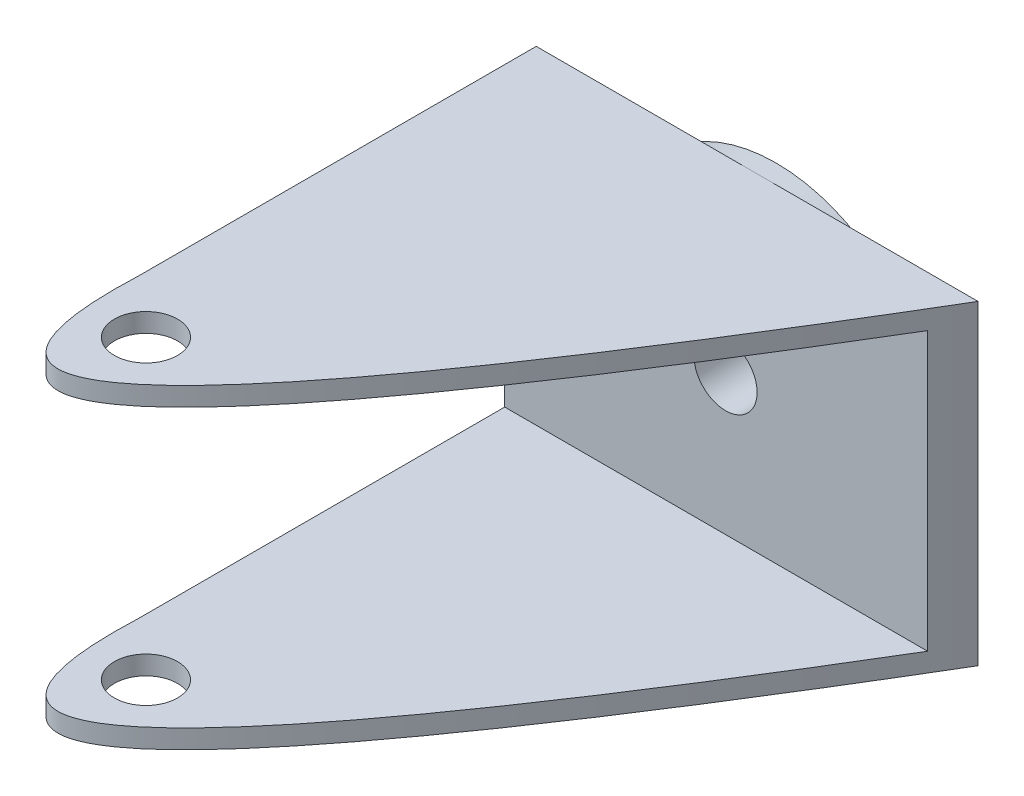
ISO-10303-21;
HEADER;
FILE_DESCRIPTION(('STEP AP214'),'2;1');
FILE_NAME('part.step','',(''),(''),'','','');
FILE_SCHEMA(('AUTOMOTIVE_DESIGN { 1 0 10303 214 1 1 1 1 }'));
ENDSEC;
DATA;
#1=APPLICATION_CONTEXT('core data for automotive mechanical design processes');
#2=APPLICATION_PROTOCOL_DEFINITION('international standard','automotive_design',2000,#1);
#3=PRODUCT_CONTEXT('',#1,'mechanical');
#4=PRODUCT('Part','Part','',(#3));
#5=PRODUCT_RELATED_PRODUCT_CATEGORY('part','',(#4));
#6=PRODUCT_DEFINITION_FORMATION('','',#4);
#7=PRODUCT_DEFINITION_CONTEXT('part definition',#1,'design');
#8=PRODUCT_DEFINITION('design','',#6,#7);
#9=PRODUCT_DEFINITION_SHAPE('','',#8);
#10=(LENGTH_UNIT() NAMED_UNIT(*) SI_UNIT(.MILLI.,.METRE.));
#11=(NAMED_UNIT(*) PLANE_ANGLE_UNIT() SI_UNIT($,.RADIAN.));
#12=(NAMED_UNIT(*) SI_UNIT($,.STERADIAN.) SOLID_ANGLE_UNIT());
#13=UNCERTAINTY_MEASURE_WITH_UNIT(LENGTH_MEASURE(1.E-05),#10,'distance_accuracy_value','');
#14=(GEOMETRIC_REPRESENTATION_CONTEXT(3) GLOBAL_UNCERTAINTY_ASSIGNED_CONTEXT((#13)) GLOBAL_UNIT_ASSIGNED_CONTEXT((#10,
#11,#12)) REPRESENTATION_CONTEXT('',''));
#15=CARTESIAN_POINT('',(0.,0.,0.));
#16=DIRECTION('',(0.,0.,1.));
#17=DIRECTION('',(1.,0.,0.));
#18=AXIS2_PLACEMENT_3D('',#15,#16,#17);
#19=CARTESIAN_POINT('',(-11.3967103896445,39.999851338685,-63.5108558657194));
#20=DIRECTION('',(0.,0.,1.));
#21=DIRECTION('',(1.,0.,0.));
#22=AXIS2_PLACEMENT_3D('',#19,#20,#21);
#23=PLANE('',#22);
#24=CARTESIAN_POINT('',(9.60328961035546,24.999851338685,-63.5108558657194));
#25=DIRECTION('',(0.,0.,-1.));
#26=DIRECTION('',(-1.,0.,0.));
#27=AXIS2_PLACEMENT_3D('',#24,#25,#26);
#28=CIRCLE('',#27,15.);
#29=CARTESIAN_POINT('',(9.60328961035546,9.99985133868499,-63.5108558657194));
#30=VERTEX_POINT('',#29);
#31=CARTESIAN_POINT('',(9.60328961035546,39.999851338685,-63.5108558657194));
#32=VERTEX_POINT('',#31);
#33=EDGE_CURVE('E120',#30,#32,#28,.T.);
#34=ORIENTED_EDGE('',*,*,#33,.F.);
#35=DIRECTION('',(-1.,0.,0.));
#36=VECTOR('',#35,1.);
#37=CARTESIAN_POINT('',(-11.3967103896445,9.99985133868499,-63.5108558657194));
#38=LINE('',#37,#36);
#39=CARTESIAN_POINT('',(-11.3967103896445,9.99985133868499,-63.5108558657194));
#40=VERTEX_POINT('',#39);
#41=EDGE_CURVE('E110',#30,#40,#38,.T.);
#42=ORIENTED_EDGE('',*,*,#41,.T.);
#43=DIRECTION('',(0.,-1.,0.));
#44=VECTOR('',#43,1.);
#45=CARTESIAN_POINT('',(-11.3967103896445,39.999851338685,-63.5108558657194));
#46=LINE('',#45,#44);
#47=CARTESIAN_POINT('',(-11.3967103896445,39.999851338685,-63.5108558657194));
#48=VERTEX_POINT('',#47);
#49=EDGE_CURVE('E11',#48,#40,#46,.T.);
#50=ORIENTED_EDGE('',*,*,#49,.F.);
#51=DIRECTION('',(-1.,0.,0.));
#52=VECTOR('',#51,1.);
#53=CARTESIAN_POINT('',(-11.3967103896445,39.999851338685,-63.5108558657194));
#54=LINE('',#53,#52);
#55=EDGE_CURVE('E83',#32,#48,#54,.T.);
#56=ORIENTED_EDGE('',*,*,#55,.F.);
#57=EDGE_LOOP('',(#34,#42,#50,#56));
#58=FACE_BOUND('',#57,.T.);
#59=ADVANCED_FACE('F40',(#58),#23,.F.);
#60=CARTESIAN_POINT('',(-5.99671038964455,9.99985133868499,-21.0034346858909));
#61=DIRECTION('',(0.,1.,0.));
#62=DIRECTION('',(0.,0.,1.));
#63=AXIS2_PLACEMENT_3D('',#60,#61,#62);
#64=CYLINDRICAL_SURFACE('',#63,3.);
#65=CARTESIAN_POINT('',(-5.99671038964455,38.199851338685,-21.0034346858909));
#66=DIRECTION('',(0.,1.,0.));
#67=DIRECTION('',(0.,0.,1.));
#68=AXIS2_PLACEMENT_3D('',#65,#66,#67);
#69=CIRCLE('',#68,3.);
#70=CARTESIAN_POINT('',(-5.99671038964455,38.199851338685,-18.0034346858909));
#71=VERTEX_POINT('',#70);
#72=EDGE_CURVE('E151',#71,#71,#69,.F.);
#73=ORIENTED_EDGE('',*,*,#72,.T.);
#74=EDGE_LOOP('',(#73));
#75=FACE_BOUND('',#74,.T.);
#76=CARTESIAN_POINT('',(-5.99671038964455,39.999851338685,-21.0034346858909));
#77=DIRECTION('',(0.,1.,0.));
#78=DIRECTION('',(0.,0.,1.));
#79=AXIS2_PLACEMENT_3D('',#76,#77,#78);
#80=CIRCLE('',#79,3.);
#81=CARTESIAN_POINT('',(-5.99671038964455,39.999851338685,-18.0034346858909));
#82=VERTEX_POINT('',#81);
#83=EDGE_CURVE('E160',#82,#82,#80,.T.);
#84=ORIENTED_EDGE('',*,*,#83,.T.);
#85=EDGE_LOOP('',(#84));
#86=FACE_BOUND('',#85,.T.);
#87=ADVANCED_FACE('F192',(#75,#86),#64,.F.);
#88=EDGE_CURVE('E57',#32,#30,#28,.T.);
#89=ORIENTED_EDGE('',*,*,#88,.F.);
#90=CARTESIAN_POINT('',(30.6032896103555,39.999851338685,-63.5108558657194));
#91=VERTEX_POINT('',#90);
#92=EDGE_CURVE('E168',#91,#32,#54,.T.);
#93=ORIENTED_EDGE('',*,*,#92,.F.);
#94=DIRECTION('',(0.,-1.,0.));
#95=VECTOR('',#94,1.);
#96=CARTESIAN_POINT('',(30.6032896103555,39.999851338685,-63.5108558657194));
#97=LINE('',#96,#95);
#98=CARTESIAN_POINT('',(30.6032896103555,9.99985133868499,-63.5108558657194));
#99=VERTEX_POINT('',#98);
#100=EDGE_CURVE('E80',#91,#99,#97,.T.);
#101=ORIENTED_EDGE('',*,*,#100,.T.);
#102=EDGE_CURVE('E105',#99,#30,#38,.T.);
#103=ORIENTED_EDGE('',*,*,#102,.T.);
#104=EDGE_LOOP('',(#89,#93,#101,#103));
#105=FACE_BOUND('',#104,.T.);
#106=ADVANCED_FACE('F42',(#105),#23,.F.);
#107=CARTESIAN_POINT('',(-11.3967103896445,39.999851338685,-25.8500972073343));
#108=DIRECTION('',(1.,0.,0.));
#109=DIRECTION('',(0.,0.,-1.));
#110=AXIS2_PLACEMENT_3D('',#107,#108,#109);
#111=PLANE('',#110);
#112=DIRECTION('',(0.,-1.,0.));
#113=VECTOR('',#112,1.);
#114=CARTESIAN_POINT('',(-11.3967103896445,38.199851338685,-60.5108558657194));
#115=LINE('',#114,#113);
#116=CARTESIAN_POINT('',(-11.3967103896445,38.199851338685,-60.5108558657194));
#117=VERTEX_POINT('',#116);
#118=CARTESIAN_POINT('',(-11.3967103896445,11.799851338685,-60.5108558657194));
#119=VERTEX_POINT('',#118);
#120=EDGE_CURVE('E127',#117,#119,#115,.T.);
#121=ORIENTED_EDGE('',*,*,#120,.F.);
#122=DIRECTION('',(0.,0.,-1.));
#123=VECTOR('',#122,1.);
#124=CARTESIAN_POINT('',(-11.3967103896445,38.199851338685,-60.5108558657194));
#125=LINE('',#124,#123);
#126=CARTESIAN_POINT('',(-11.3967103896445,38.199851338685,-25.8500972073343));
#127=VERTEX_POINT('',#126);
#128=EDGE_CURVE('E136',#127,#117,#125,.T.);
#129=ORIENTED_EDGE('',*,*,#128,.F.);
#130=DIRECTION('',(0.,-1.,0.));
#131=VECTOR('',#130,1.);
#132=CARTESIAN_POINT('',(-11.3967103896445,39.999851338685,-25.8500972073343));
#133=LINE('',#132,#131);
#134=CARTESIAN_POINT('',(-11.3967103896445,39.999851338685,-25.8500972073343));
#135=VERTEX_POINT('',#134);
#136=EDGE_CURVE('E49',#135,#127,#133,.T.);
#137=ORIENTED_EDGE('',*,*,#136,.F.);
#138=DIRECTION('',(0.,0.,1.));
#139=VECTOR('',#138,1.);
#140=CARTESIAN_POINT('',(-11.3967103896445,39.999851338685,-25.8500972073343));
#141=LINE('',#140,#139);
#142=EDGE_CURVE('E170',#48,#135,#141,.T.);
#143=ORIENTED_EDGE('',*,*,#142,.F.);
#144=ORIENTED_EDGE('',*,*,#49,.T.);
#145=DIRECTION('',(0.,0.,1.));
#146=VECTOR('',#145,1.);
#147=CARTESIAN_POINT('',(-11.3967103896445,9.99985133868499,-25.8500972073343));
#148=LINE('',#147,#146);
#149=CARTESIAN_POINT('',(-11.3967103896445,9.99985133868499,-25.8500972073343));
#150=VERTEX_POINT('',#149);
#151=EDGE_CURVE('E109',#40,#150,#148,.T.);
#152=ORIENTED_EDGE('',*,*,#151,.T.);
#153=CARTESIAN_POINT('',(-11.3967103896445,11.799851338685,-25.8500972073343));
#154=VERTEX_POINT('',#153);
#155=EDGE_CURVE('E231',#154,#150,#133,.T.);
#156=ORIENTED_EDGE('',*,*,#155,.F.);
#157=DIRECTION('',(0.,0.,1.));
#158=VECTOR('',#157,1.);
#159=CARTESIAN_POINT('',(-11.3967103896445,11.799851338685,-60.5108558657194));
#160=LINE('',#159,#158);
#161=EDGE_CURVE('E133',#119,#154,#160,.T.);
#162=ORIENTED_EDGE('',*,*,#161,.F.);
#163=EDGE_LOOP('',(#121,#129,#137,#143,#144,#152,#156,#162));
#164=FACE_BOUND('',#163,.T.);
#165=ADVANCED_FACE('F184',(#164),#111,.F.);
#166=CARTESIAN_POINT('',(-11.3967103896445,39.999851338685,-25.8500972073343));
#167=CARTESIAN_POINT('',(-12.930863878575,39.999851338685,9.72178243304607));
#168=CARTESIAN_POINT('',(30.6032896103555,39.999851338685,-63.5108558657194));
#169=B_SPLINE_CURVE_WITH_KNOTS('',2,(#166,#167,#168),.UNSPECIFIED.,.F.,.F.,(3,3),(0.,1.),.UNSPECIFIED.);
#170=DIRECTION('',(0.,-1.,0.));
#171=VECTOR('',#170,1.);
#172=SURFACE_OF_LINEAR_EXTRUSION('',#169,#171);
#173=CARTESIAN_POINT('',(-11.3967103896445,11.799851338685,-25.8500972073343));
#174=CARTESIAN_POINT('',(-12.930863878575,11.799851338685,9.72178243304607));
#175=CARTESIAN_POINT('',(30.6032896103555,11.799851338685,-63.5108558657194));
#176=B_SPLINE_CURVE_WITH_KNOTS('',2,(#173,#174,#175),.UNSPECIFIED.,.F.,.F.,(3,3),(0.,1.),.UNSPECIFIED.);
#177=CARTESIAN_POINT('',(28.8114097880873,11.799851338685,-60.5108558657194));
#178=VERTEX_POINT('',#177);
#179=EDGE_CURVE('E147',#178,#154,#176,.F.);
#180=ORIENTED_EDGE('',*,*,#179,.T.);
#181=ORIENTED_EDGE('',*,*,#155,.T.);
#182=CARTESIAN_POINT('',(-11.3967103896445,9.99985133868499,-25.8500972073343));
#183=CARTESIAN_POINT('',(-12.930863878575,9.99985133868499,9.72178243304607));
#184=CARTESIAN_POINT('',(30.6032896103555,9.99985133868499,-63.5108558657194));
#185=B_SPLINE_CURVE_WITH_KNOTS('',2,(#182,#183,#184),.UNSPECIFIED.,.F.,.F.,(3,3),(0.,1.),.UNSPECIFIED.);
#186=EDGE_CURVE('E234',#150,#99,#185,.T.);
#187=ORIENTED_EDGE('',*,*,#186,.T.);
#188=ORIENTED_EDGE('',*,*,#100,.F.);
#189=EDGE_CURVE('E66',#135,#91,#169,.T.);
#190=ORIENTED_EDGE('',*,*,#189,.F.);
#191=ORIENTED_EDGE('',*,*,#136,.T.);
#192=CARTESIAN_POINT('',(-11.3967103896445,38.199851338685,-25.8500972073343));
#193=CARTESIAN_POINT('',(-12.930863878575,38.199851338685,9.72178243304607));
#194=CARTESIAN_POINT('',(30.6032896103555,38.199851338685,-63.5108558657194));
#195=B_SPLINE_CURVE_WITH_KNOTS('',2,(#192,#193,#194),.UNSPECIFIED.,.F.,.F.,(3,3),(0.,1.),.UNSPECIFIED.);
#196=CARTESIAN_POINT('',(28.8114097880873,38.199851338685,-60.5108558657194));
#197=VERTEX_POINT('',#196);
#198=EDGE_CURVE('E152',#127,#197,#195,.T.);
#199=ORIENTED_EDGE('',*,*,#198,.T.);
#200=DIRECTION('',(0.,-1.,0.));
#201=VECTOR('',#200,1.);
#202=CARTESIAN_POINT('',(28.8114097910407,39.999851338685,-60.5108558657194));
#203=LINE('',#202,#201);
#204=EDGE_CURVE('E142',#197,#178,#203,.T.);
#205=ORIENTED_EDGE('',*,*,#204,.T.);
#206=EDGE_LOOP('',(#180,#181,#187,#188,#190,#191,#199,#205));
#207=FACE_BOUND('',#206,.T.);
#208=ADVANCED_FACE('F180',(#207),#172,.F.);
#209=CARTESIAN_POINT('',(-1.66378713410978,39.999851338685,-17.4793470517404));
#210=DIRECTION('',(0.,1.,0.));
#211=DIRECTION('',(0.,0.,1.));
#212=AXIS2_PLACEMENT_3D('',#209,#210,#211);
#213=PLANE('',#212);
#214=ORIENTED_EDGE('',*,*,#83,.F.);
#215=EDGE_LOOP('',(#214));
#216=FACE_BOUND('',#215,.T.);
#217=ORIENTED_EDGE('',*,*,#92,.T.);
#218=ORIENTED_EDGE('',*,*,#55,.T.);
#219=ORIENTED_EDGE('',*,*,#142,.T.);
#220=ORIENTED_EDGE('',*,*,#189,.T.);
#221=EDGE_LOOP('',(#217,#218,#219,#220));
#222=FACE_BOUND('',#221,.T.);
#223=ADVANCED_FACE('F183',(#216,#222),#213,.T.);
#224=CARTESIAN_POINT('',(-1.66378713410978,9.99985133868499,-17.4793470517404));
#225=DIRECTION('',(0.,1.,0.));
#226=DIRECTION('',(0.,0.,1.));
#227=AXIS2_PLACEMENT_3D('',#224,#225,#226);
#228=PLANE('',#227);
#229=CARTESIAN_POINT('',(-5.99671038964455,9.99985133868499,-21.0034346858909));
#230=DIRECTION('',(0.,1.,0.));
#231=DIRECTION('',(0.,0.,1.));
#232=AXIS2_PLACEMENT_3D('',#229,#230,#231);
#233=CIRCLE('',#232,3.);
#234=CARTESIAN_POINT('',(-5.99671038964455,9.99985133868499,-18.0034346858909));
#235=VERTEX_POINT('',#234);
#236=EDGE_CURVE('E118',#235,#235,#233,.T.);
#237=ORIENTED_EDGE('',*,*,#236,.T.);
#238=EDGE_LOOP('',(#237));
#239=FACE_BOUND('',#238,.T.);
#240=ORIENTED_EDGE('',*,*,#102,.F.);
#241=ORIENTED_EDGE('',*,*,#186,.F.);
#242=ORIENTED_EDGE('',*,*,#151,.F.);
#243=ORIENTED_EDGE('',*,*,#41,.F.);
#244=EDGE_LOOP('',(#240,#241,#242,#243));
#245=FACE_BOUND('',#244,.T.);
#246=ADVANCED_FACE('F114',(#239,#245),#228,.F.);
#247=CARTESIAN_POINT('',(-5.99671038964455,11.799851338685,-21.0034346858909));
#248=DIRECTION('',(0.,-1.,0.));
#249=DIRECTION('',(0.,0.,-1.));
#250=AXIS2_PLACEMENT_3D('',#247,#248,#249);
#251=CIRCLE('',#250,3.);
#252=CARTESIAN_POINT('',(-5.99671038964455,11.799851338685,-24.0034346858909));
#253=VERTEX_POINT('',#252);
#254=EDGE_CURVE('E146',#253,#253,#251,.F.);
#255=ORIENTED_EDGE('',*,*,#254,.T.);
#256=EDGE_LOOP('',(#255));
#257=FACE_BOUND('',#256,.T.);
#258=ORIENTED_EDGE('',*,*,#236,.F.);
#259=EDGE_LOOP('',(#258));
#260=FACE_BOUND('',#259,.T.);
#261=ADVANCED_FACE('F200',(#257,#260),#64,.F.);
#262=CARTESIAN_POINT('',(61.2032896103553,38.199851338685,-60.5108558657194));
#263=DIRECTION('',(0.,1.,0.));
#264=DIRECTION('',(0.,0.,1.));
#265=AXIS2_PLACEMENT_3D('',#262,#263,#264);
#266=PLANE('',#265);
#267=ORIENTED_EDGE('',*,*,#72,.F.);
#268=EDGE_LOOP('',(#267));
#269=FACE_BOUND('',#268,.T.);
#270=ORIENTED_EDGE('',*,*,#198,.F.);
#271=ORIENTED_EDGE('',*,*,#128,.T.);
#272=DIRECTION('',(-1.,0.,0.));
#273=VECTOR('',#272,1.);
#274=CARTESIAN_POINT('',(61.2032896103553,38.199851338685,-60.5108558657194));
#275=LINE('',#274,#273);
#276=EDGE_CURVE('E139',#197,#117,#275,.T.);
#277=ORIENTED_EDGE('',*,*,#276,.F.);
#278=EDGE_LOOP('',(#270,#271,#277));
#279=FACE_BOUND('',#278,.T.);
#280=ADVANCED_FACE('F207',(#269,#279),#266,.F.);
#281=CARTESIAN_POINT('',(61.2032896103553,11.799851338685,-60.5108558657194));
#282=DIRECTION('',(0.,-1.,0.));
#283=DIRECTION('',(0.,0.,-1.));
#284=AXIS2_PLACEMENT_3D('',#281,#282,#283);
#285=PLANE('',#284);
#286=ORIENTED_EDGE('',*,*,#254,.F.);
#287=EDGE_LOOP('',(#286));
#288=FACE_BOUND('',#287,.T.);
#289=DIRECTION('',(-1.,0.,0.));
#290=VECTOR('',#289,1.);
#291=CARTESIAN_POINT('',(61.2032896103553,11.799851338685,-60.5108558657194));
#292=LINE('',#291,#290);
#293=EDGE_CURVE('E138',#178,#119,#292,.T.);
#294=ORIENTED_EDGE('',*,*,#293,.T.);
#295=ORIENTED_EDGE('',*,*,#161,.T.);
#296=ORIENTED_EDGE('',*,*,#179,.F.);
#297=EDGE_LOOP('',(#294,#295,#296));
#298=FACE_BOUND('',#297,.T.);
#299=ADVANCED_FACE('F213',(#288,#298),#285,.F.);
#300=CARTESIAN_POINT('',(61.2032896103553,38.199851338685,-60.5108558657194));
#301=DIRECTION('',(0.,0.,-1.));
#302=DIRECTION('',(-1.,0.,0.));
#303=AXIS2_PLACEMENT_3D('',#300,#301,#302);
#304=PLANE('',#303);
#305=CARTESIAN_POINT('',(9.60328961035545,24.999851338685,-60.5108558657194));
#306=DIRECTION('',(0.,0.,-1.));
#307=DIRECTION('',(-1.,0.,0.));
#308=AXIS2_PLACEMENT_3D('',#305,#306,#307);
#309=CIRCLE('',#308,3.);
#310=CARTESIAN_POINT('',(6.60328961035545,24.999851338685,-60.5108558657194));
#311=VERTEX_POINT('',#310);
#312=EDGE_CURVE('E122',#311,#311,#309,.T.);
#313=ORIENTED_EDGE('',*,*,#312,.T.);
#314=EDGE_LOOP('',(#313));
#315=FACE_BOUND('',#314,.T.);
#316=ORIENTED_EDGE('',*,*,#276,.T.);
#317=ORIENTED_EDGE('',*,*,#120,.T.);
#318=ORIENTED_EDGE('',*,*,#293,.F.);
#319=ORIENTED_EDGE('',*,*,#204,.F.);
#320=EDGE_LOOP('',(#316,#317,#318,#319));
#321=FACE_BOUND('',#320,.T.);
#322=ADVANCED_FACE('F244',(#315,#321),#304,.F.);
#323=CARTESIAN_POINT('',(9.60328961035546,24.999851338685,-65.3108558657194));
#324=DIRECTION('',(0.,0.,1.));
#325=DIRECTION('',(1.,0.,0.));
#326=AXIS2_PLACEMENT_3D('',#323,#324,#325);
#327=CYLINDRICAL_SURFACE('',#326,15.);
#328=CARTESIAN_POINT('',(9.60328961035546,24.999851338685,-65.3108558657194));
#329=DIRECTION('',(0.,0.,-1.));
#330=DIRECTION('',(-1.,0.,0.));
#331=AXIS2_PLACEMENT_3D('',#328,#329,#330);
#332=CIRCLE('',#331,15.);
#333=CARTESIAN_POINT('',(-5.39671038964454,24.999851338685,-65.3108558657194));
#334=VERTEX_POINT('',#333);
#335=EDGE_CURVE('E125',#334,#334,#332,.T.);
#336=ORIENTED_EDGE('',*,*,#335,.F.);
#337=EDGE_LOOP('',(#336));
#338=FACE_BOUND('',#337,.T.);
#339=ORIENTED_EDGE('',*,*,#88,.T.);
#340=ORIENTED_EDGE('',*,*,#33,.T.);
#341=EDGE_LOOP('',(#339,#340));
#342=FACE_BOUND('',#341,.T.);
#343=ADVANCED_FACE('F124',(#338,#342),#327,.T.);
#344=CARTESIAN_POINT('',(9.60328961035546,24.999851338685,-65.3108558657194));
#345=DIRECTION('',(0.,0.,-1.));
#346=DIRECTION('',(-1.,0.,0.));
#347=AXIS2_PLACEMENT_3D('',#344,#345,#346);
#348=PLANE('',#347);
#349=CARTESIAN_POINT('',(9.60328961035545,24.999851338685,-65.3108558657194));
#350=DIRECTION('',(0.,0.,-1.));
#351=DIRECTION('',(-1.,0.,0.));
#352=AXIS2_PLACEMENT_3D('',#349,#350,#351);
#353=CIRCLE('',#352,3.);
#354=CARTESIAN_POINT('',(6.60328961035545,24.999851338685,-65.3108558657194));
#355=VERTEX_POINT('',#354);
#356=EDGE_CURVE('E44',#355,#355,#353,.T.);
#357=ORIENTED_EDGE('',*,*,#356,.F.);
#358=EDGE_LOOP('',(#357));
#359=FACE_BOUND('',#358,.T.);
#360=ORIENTED_EDGE('',*,*,#335,.T.);
#361=EDGE_LOOP('',(#360));
#362=FACE_BOUND('',#361,.T.);
#363=ADVANCED_FACE('F251',(#359,#362),#348,.T.);
#364=CARTESIAN_POINT('',(9.60328961035545,24.999851338685,-59.6108558657194));
#365=DIRECTION('',(0.,0.,-1.));
#366=DIRECTION('',(-1.,0.,0.));
#367=AXIS2_PLACEMENT_3D('',#364,#365,#366);
#368=CYLINDRICAL_SURFACE('',#367,3.);
#369=ORIENTED_EDGE('',*,*,#356,.T.);
#370=EDGE_LOOP('',(#369));
#371=FACE_BOUND('',#370,.T.);
#372=ORIENTED_EDGE('',*,*,#312,.F.);
#373=EDGE_LOOP('',(#372));
#374=FACE_BOUND('',#373,.T.);
#375=ADVANCED_FACE('F259',(#371,#374),#368,.F.);
#376=CLOSED_SHELL('',(#59,#87,#106,#165,#208,#223,#246,#261,#280,#299,#322,#343,#363,#375));
#377=MANIFOLD_SOLID_BREP('B2',#376);
#378=ADVANCED_BREP_SHAPE_REPRESENTATION('',(#18,#377),#14);
#379=SHAPE_DEFINITION_REPRESENTATION(#9,#378);
ENDSEC;
END-ISO-10303-21;
